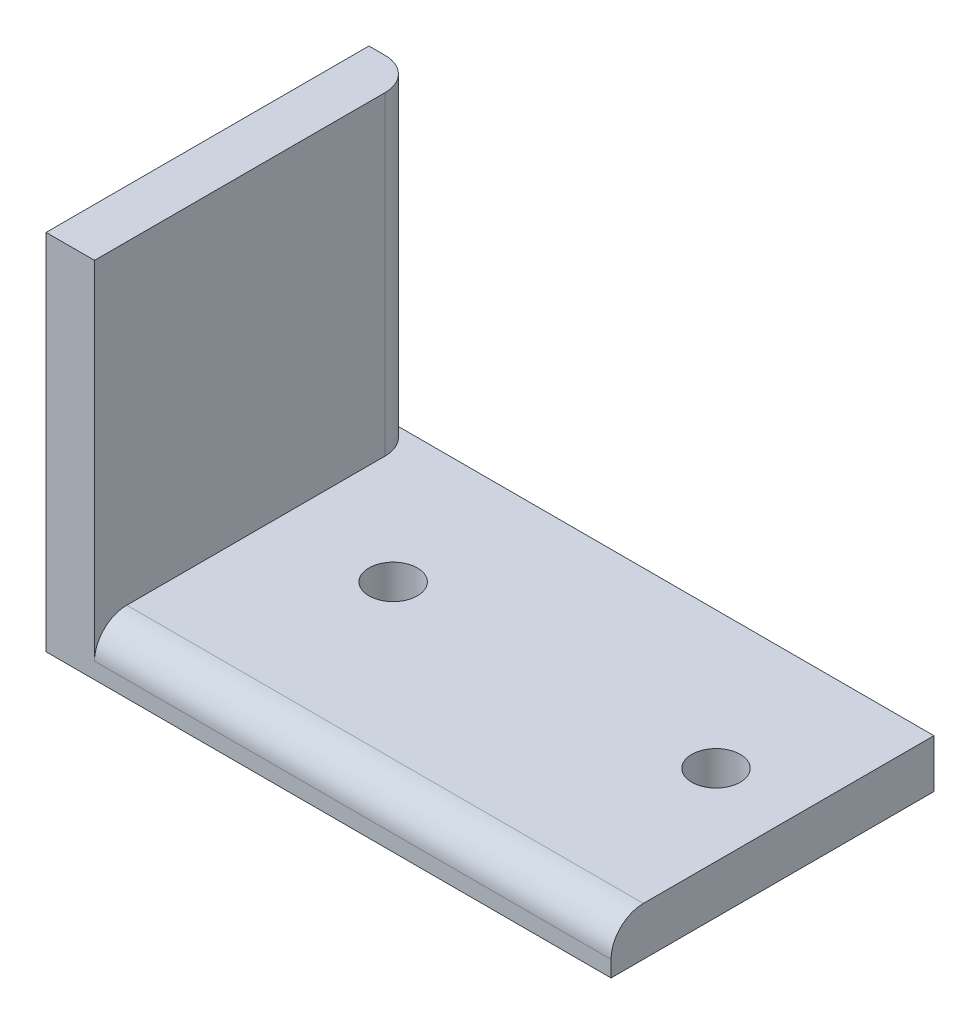
ISO-10303-21;
HEADER;
FILE_DESCRIPTION(('STEP AP214'),'2;1');
FILE_NAME('part.step','',(''),(''),'','','');
FILE_SCHEMA(('AUTOMOTIVE_DESIGN { 1 0 10303 214 1 1 1 1 }'));
ENDSEC;
DATA;
#1=APPLICATION_CONTEXT('core data for automotive mechanical design processes');
#2=APPLICATION_PROTOCOL_DEFINITION('international standard','automotive_design',2000,#1);
#3=PRODUCT_CONTEXT('',#1,'mechanical');
#4=PRODUCT('Part','Part','',(#3));
#5=PRODUCT_RELATED_PRODUCT_CATEGORY('part','',(#4));
#6=PRODUCT_DEFINITION_FORMATION('','',#4);
#7=PRODUCT_DEFINITION_CONTEXT('part definition',#1,'design');
#8=PRODUCT_DEFINITION('design','',#6,#7);
#9=PRODUCT_DEFINITION_SHAPE('','',#8);
#10=(LENGTH_UNIT() NAMED_UNIT(*) SI_UNIT(.MILLI.,.METRE.));
#11=(NAMED_UNIT(*) PLANE_ANGLE_UNIT() SI_UNIT($,.RADIAN.));
#12=(NAMED_UNIT(*) SI_UNIT($,.STERADIAN.) SOLID_ANGLE_UNIT());
#13=UNCERTAINTY_MEASURE_WITH_UNIT(LENGTH_MEASURE(1.E-05),#10,'distance_accuracy_value','');
#14=(GEOMETRIC_REPRESENTATION_CONTEXT(3) GLOBAL_UNCERTAINTY_ASSIGNED_CONTEXT((#13)) GLOBAL_UNIT_ASSIGNED_CONTEXT((#10,
#11,#12)) REPRESENTATION_CONTEXT('',''));
#15=CARTESIAN_POINT('',(0.,0.,0.));
#16=DIRECTION('',(0.,0.,1.));
#17=DIRECTION('',(1.,0.,0.));
#18=AXIS2_PLACEMENT_3D('',#15,#16,#17);
#19=CARTESIAN_POINT('',(0.,90.,40.));
#20=DIRECTION('',(1.,0.,0.));
#21=DIRECTION('',(0.,0.,-1.));
#22=AXIS2_PLACEMENT_3D('',#19,#20,#21);
#23=PLANE('',#22);
#24=DIRECTION('',(0.,-1.,0.));
#25=VECTOR('',#24,1.);
#26=CARTESIAN_POINT('',(0.,90.,-40.));
#27=LINE('',#26,#25);
#28=CARTESIAN_POINT('',(0.,90.,-40.));
#29=VERTEX_POINT('',#28);
#30=CARTESIAN_POINT('',(0.,0.,-40.));
#31=VERTEX_POINT('',#30);
#32=EDGE_CURVE('E131',#29,#31,#27,.T.);
#33=ORIENTED_EDGE('',*,*,#32,.T.);
#34=DIRECTION('',(0.,0.,-1.));
#35=VECTOR('',#34,1.);
#36=CARTESIAN_POINT('',(0.,0.,40.));
#37=LINE('',#36,#35);
#38=CARTESIAN_POINT('',(0.,0.,40.));
#39=VERTEX_POINT('',#38);
#40=EDGE_CURVE('E111',#39,#31,#37,.T.);
#41=ORIENTED_EDGE('',*,*,#40,.F.);
#42=DIRECTION('',(0.,-1.,0.));
#43=VECTOR('',#42,1.);
#44=CARTESIAN_POINT('',(0.,90.,40.));
#45=LINE('',#44,#43);
#46=CARTESIAN_POINT('',(0.,90.,40.));
#47=VERTEX_POINT('',#46);
#48=EDGE_CURVE('E119',#47,#39,#45,.T.);
#49=ORIENTED_EDGE('',*,*,#48,.F.);
#50=DIRECTION('',(0.,0.,-1.));
#51=VECTOR('',#50,1.);
#52=CARTESIAN_POINT('',(0.,90.,40.));
#53=LINE('',#52,#51);
#54=EDGE_CURVE('E168',#47,#29,#53,.T.);
#55=ORIENTED_EDGE('',*,*,#54,.T.);
#56=EDGE_LOOP('',(#33,#41,#49,#55));
#57=FACE_BOUND('',#56,.T.);
#58=ADVANCED_FACE('F41',(#57),#23,.F.);
#59=CARTESIAN_POINT('',(0.,0.,40.));
#60=DIRECTION('',(0.,1.,0.));
#61=DIRECTION('',(0.,0.,1.));
#62=AXIS2_PLACEMENT_3D('',#59,#60,#61);
#63=PLANE('',#62);
#64=CARTESIAN_POINT('',(120.,0.,-6.));
#65=DIRECTION('',(0.,1.,0.));
#66=DIRECTION('',(0.,0.,1.));
#67=AXIS2_PLACEMENT_3D('',#64,#65,#66);
#68=CIRCLE('',#67,6.00000000000002);
#69=CARTESIAN_POINT('',(120.,0.,-12.));
#70=VERTEX_POINT('',#69);
#71=EDGE_CURVE('E162',#70,#70,#68,.T.);
#72=ORIENTED_EDGE('',*,*,#71,.T.);
#73=EDGE_LOOP('',(#72));
#74=FACE_BOUND('',#73,.T.);
#75=CARTESIAN_POINT('',(40.,0.,-6.));
#76=DIRECTION('',(0.,1.,0.));
#77=DIRECTION('',(0.,0.,1.));
#78=AXIS2_PLACEMENT_3D('',#75,#76,#77);
#79=CIRCLE('',#78,5.99999999999999);
#80=CARTESIAN_POINT('',(40.,0.,-12.));
#81=VERTEX_POINT('',#80);
#82=EDGE_CURVE('E152',#81,#81,#79,.T.);
#83=ORIENTED_EDGE('',*,*,#82,.T.);
#84=EDGE_LOOP('',(#83));
#85=FACE_BOUND('',#84,.T.);
#86=DIRECTION('',(1.,0.,0.));
#87=VECTOR('',#86,1.);
#88=CARTESIAN_POINT('',(0.,0.,-40.));
#89=LINE('',#88,#87);
#90=CARTESIAN_POINT('',(140.,0.,-40.));
#91=VERTEX_POINT('',#90);
#92=EDGE_CURVE('E155',#31,#91,#89,.T.);
#93=ORIENTED_EDGE('',*,*,#92,.T.);
#94=DIRECTION('',(0.,0.,-1.));
#95=VECTOR('',#94,1.);
#96=CARTESIAN_POINT('',(140.,0.,40.));
#97=LINE('',#96,#95);
#98=CARTESIAN_POINT('',(140.,0.,40.));
#99=VERTEX_POINT('',#98);
#100=EDGE_CURVE('E114',#99,#91,#97,.T.);
#101=ORIENTED_EDGE('',*,*,#100,.F.);
#102=DIRECTION('',(1.,0.,0.));
#103=VECTOR('',#102,1.);
#104=CARTESIAN_POINT('',(0.,0.,40.));
#105=LINE('',#104,#103);
#106=EDGE_CURVE('E107',#39,#99,#105,.T.);
#107=ORIENTED_EDGE('',*,*,#106,.F.);
#108=ORIENTED_EDGE('',*,*,#40,.T.);
#109=EDGE_LOOP('',(#93,#101,#107,#108));
#110=FACE_BOUND('',#109,.T.);
#111=ADVANCED_FACE('F109',(#74,#85,#110),#63,.F.);
#112=CARTESIAN_POINT('',(140.,0.,40.));
#113=DIRECTION('',(-1.,0.,0.));
#114=DIRECTION('',(0.,0.,1.));
#115=AXIS2_PLACEMENT_3D('',#112,#113,#114);
#116=PLANE('',#115);
#117=DIRECTION('',(0.,0.,-1.));
#118=VECTOR('',#117,1.);
#119=CARTESIAN_POINT('',(140.,12.,40.));
#120=LINE('',#119,#118);
#121=CARTESIAN_POINT('',(140.,12.,32.));
#122=VERTEX_POINT('',#121);
#123=CARTESIAN_POINT('',(140.,12.,-40.));
#124=VERTEX_POINT('',#123);
#125=EDGE_CURVE('E137',#122,#124,#120,.T.);
#126=ORIENTED_EDGE('',*,*,#125,.F.);
#127=CARTESIAN_POINT('',(140.,4.,32.));
#128=DIRECTION('',(-1.,0.,0.));
#129=DIRECTION('',(0.,0.,1.));
#130=AXIS2_PLACEMENT_3D('',#127,#128,#129);
#131=CIRCLE('',#130,8.);
#132=CARTESIAN_POINT('',(140.,4.,40.));
#133=VERTEX_POINT('',#132);
#134=EDGE_CURVE('E142',#122,#133,#131,.F.);
#135=ORIENTED_EDGE('',*,*,#134,.T.);
#136=DIRECTION('',(0.,1.,0.));
#137=VECTOR('',#136,1.);
#138=CARTESIAN_POINT('',(140.,0.,40.));
#139=LINE('',#138,#137);
#140=EDGE_CURVE('E118',#99,#133,#139,.T.);
#141=ORIENTED_EDGE('',*,*,#140,.F.);
#142=ORIENTED_EDGE('',*,*,#100,.T.);
#143=DIRECTION('',(0.,1.,0.));
#144=VECTOR('',#143,1.);
#145=CARTESIAN_POINT('',(140.,0.,-40.));
#146=LINE('',#145,#144);
#147=EDGE_CURVE('E171',#91,#124,#146,.T.);
#148=ORIENTED_EDGE('',*,*,#147,.T.);
#149=EDGE_LOOP('',(#126,#135,#141,#142,#148));
#150=FACE_BOUND('',#149,.T.);
#151=ADVANCED_FACE('F188',(#150),#116,.F.);
#152=CARTESIAN_POINT('',(140.,12.,40.));
#153=DIRECTION('',(0.,-1.,0.));
#154=DIRECTION('',(0.,0.,-1.));
#155=AXIS2_PLACEMENT_3D('',#152,#153,#154);
#156=PLANE('',#155);
#157=CARTESIAN_POINT('',(120.,12.,-6.));
#158=DIRECTION('',(0.,-1.,0.));
#159=DIRECTION('',(0.,0.,-1.));
#160=AXIS2_PLACEMENT_3D('',#157,#158,#159);
#161=CIRCLE('',#160,6.00000000000002);
#162=CARTESIAN_POINT('',(120.,12.,-12.));
#163=VERTEX_POINT('',#162);
#164=EDGE_CURVE('E45',#163,#163,#161,.F.);
#165=ORIENTED_EDGE('',*,*,#164,.F.);
#166=EDGE_LOOP('',(#165));
#167=FACE_BOUND('',#166,.T.);
#168=CARTESIAN_POINT('',(40.,12.,-6.));
#169=DIRECTION('',(0.,-1.,0.));
#170=DIRECTION('',(0.,0.,-1.));
#171=AXIS2_PLACEMENT_3D('',#168,#169,#170);
#172=CIRCLE('',#171,5.99999999999999);
#173=CARTESIAN_POINT('',(40.,12.,-12.));
#174=VERTEX_POINT('',#173);
#175=EDGE_CURVE('E150',#174,#174,#172,.F.);
#176=ORIENTED_EDGE('',*,*,#175,.F.);
#177=EDGE_LOOP('',(#176));
#178=FACE_BOUND('',#177,.T.);
#179=DIRECTION('',(0.,0.,-1.));
#180=VECTOR('',#179,1.);
#181=CARTESIAN_POINT('',(12.,12.,40.));
#182=LINE('',#181,#180);
#183=CARTESIAN_POINT('',(12.,12.,32.));
#184=VERTEX_POINT('',#183);
#185=CARTESIAN_POINT('',(12.,12.,-32.));
#186=VERTEX_POINT('',#185);
#187=EDGE_CURVE('E179',#184,#186,#182,.T.);
#188=ORIENTED_EDGE('',*,*,#187,.F.);
#189=DIRECTION('',(-1.,0.,0.));
#190=VECTOR('',#189,1.);
#191=CARTESIAN_POINT('',(140.,12.,32.));
#192=LINE('',#191,#190);
#193=EDGE_CURVE('E135',#184,#122,#192,.F.);
#194=ORIENTED_EDGE('',*,*,#193,.T.);
#195=ORIENTED_EDGE('',*,*,#125,.T.);
#196=DIRECTION('',(-1.,0.,0.));
#197=VECTOR('',#196,1.);
#198=CARTESIAN_POINT('',(140.,12.,-40.));
#199=LINE('',#198,#197);
#200=CARTESIAN_POINT('',(4.,12.,-40.));
#201=VERTEX_POINT('',#200);
#202=EDGE_CURVE('E57',#124,#201,#199,.T.);
#203=ORIENTED_EDGE('',*,*,#202,.T.);
#204=CARTESIAN_POINT('',(4.,12.,-32.));
#205=DIRECTION('',(0.,-1.,0.));
#206=DIRECTION('',(0.,0.,-1.));
#207=AXIS2_PLACEMENT_3D('',#204,#205,#206);
#208=CIRCLE('',#207,8.);
#209=EDGE_CURVE('E11',#201,#186,#208,.T.);
#210=ORIENTED_EDGE('',*,*,#209,.T.);
#211=EDGE_LOOP('',(#188,#194,#195,#203,#210));
#212=FACE_BOUND('',#211,.T.);
#213=ADVANCED_FACE('F183',(#167,#178,#212),#156,.F.);
#214=CARTESIAN_POINT('',(12.,12.,40.));
#215=DIRECTION('',(-1.,0.,0.));
#216=DIRECTION('',(0.,0.,1.));
#217=AXIS2_PLACEMENT_3D('',#214,#215,#216);
#218=PLANE('',#217);
#219=ORIENTED_EDGE('',*,*,#187,.T.);
#220=DIRECTION('',(0.,1.,0.));
#221=VECTOR('',#220,1.);
#222=CARTESIAN_POINT('',(12.,12.,-32.));
#223=LINE('',#222,#221);
#224=CARTESIAN_POINT('',(12.,90.,-32.));
#225=VERTEX_POINT('',#224);
#226=EDGE_CURVE('E144',#186,#225,#223,.T.);
#227=ORIENTED_EDGE('',*,*,#226,.T.);
#228=DIRECTION('',(0.,0.,-1.));
#229=VECTOR('',#228,1.);
#230=CARTESIAN_POINT('',(12.,90.,40.));
#231=LINE('',#230,#229);
#232=CARTESIAN_POINT('',(12.,90.,40.));
#233=VERTEX_POINT('',#232);
#234=EDGE_CURVE('E177',#233,#225,#231,.T.);
#235=ORIENTED_EDGE('',*,*,#234,.F.);
#236=DIRECTION('',(0.,1.,0.));
#237=VECTOR('',#236,1.);
#238=CARTESIAN_POINT('',(12.,12.,40.));
#239=LINE('',#238,#237);
#240=CARTESIAN_POINT('',(12.,4.,40.));
#241=VERTEX_POINT('',#240);
#242=EDGE_CURVE('E166',#241,#233,#239,.T.);
#243=ORIENTED_EDGE('',*,*,#242,.F.);
#244=CARTESIAN_POINT('',(12.,4.,32.));
#245=DIRECTION('',(-1.,0.,0.));
#246=DIRECTION('',(0.,0.,1.));
#247=AXIS2_PLACEMENT_3D('',#244,#245,#246);
#248=CIRCLE('',#247,8.);
#249=EDGE_CURVE('E50',#241,#184,#248,.T.);
#250=ORIENTED_EDGE('',*,*,#249,.T.);
#251=EDGE_LOOP('',(#219,#227,#235,#243,#250));
#252=FACE_BOUND('',#251,.T.);
#253=ADVANCED_FACE('F196',(#252),#218,.F.);
#254=CARTESIAN_POINT('',(12.,90.,40.));
#255=DIRECTION('',(0.,-1.,0.));
#256=DIRECTION('',(0.,0.,-1.));
#257=AXIS2_PLACEMENT_3D('',#254,#255,#256);
#258=PLANE('',#257);
#259=ORIENTED_EDGE('',*,*,#234,.T.);
#260=CARTESIAN_POINT('',(4.,90.,-32.));
#261=DIRECTION('',(0.,-1.,0.));
#262=DIRECTION('',(0.,0.,-1.));
#263=AXIS2_PLACEMENT_3D('',#260,#261,#262);
#264=CIRCLE('',#263,8.);
#265=CARTESIAN_POINT('',(4.,90.,-40.));
#266=VERTEX_POINT('',#265);
#267=EDGE_CURVE('E65',#225,#266,#264,.F.);
#268=ORIENTED_EDGE('',*,*,#267,.T.);
#269=DIRECTION('',(-1.,0.,0.));
#270=VECTOR('',#269,1.);
#271=CARTESIAN_POINT('',(12.,90.,-40.));
#272=LINE('',#271,#270);
#273=EDGE_CURVE('E128',#266,#29,#272,.T.);
#274=ORIENTED_EDGE('',*,*,#273,.T.);
#275=ORIENTED_EDGE('',*,*,#54,.F.);
#276=DIRECTION('',(-1.,0.,0.));
#277=VECTOR('',#276,1.);
#278=CARTESIAN_POINT('',(12.,90.,40.));
#279=LINE('',#278,#277);
#280=EDGE_CURVE('E124',#233,#47,#279,.T.);
#281=ORIENTED_EDGE('',*,*,#280,.F.);
#282=EDGE_LOOP('',(#259,#268,#274,#275,#281));
#283=FACE_BOUND('',#282,.T.);
#284=ADVANCED_FACE('F202',(#283),#258,.F.);
#285=CARTESIAN_POINT('',(0.,0.,40.));
#286=DIRECTION('',(0.,0.,1.));
#287=DIRECTION('',(1.,0.,0.));
#288=AXIS2_PLACEMENT_3D('',#285,#286,#287);
#289=PLANE('',#288);
#290=ORIENTED_EDGE('',*,*,#140,.T.);
#291=DIRECTION('',(-1.,0.,0.));
#292=VECTOR('',#291,1.);
#293=CARTESIAN_POINT('',(12.,4.,40.));
#294=LINE('',#293,#292);
#295=EDGE_CURVE('E132',#133,#241,#294,.T.);
#296=ORIENTED_EDGE('',*,*,#295,.T.);
#297=ORIENTED_EDGE('',*,*,#242,.T.);
#298=ORIENTED_EDGE('',*,*,#280,.T.);
#299=ORIENTED_EDGE('',*,*,#48,.T.);
#300=ORIENTED_EDGE('',*,*,#106,.T.);
#301=EDGE_LOOP('',(#290,#296,#297,#298,#299,#300));
#302=FACE_BOUND('',#301,.T.);
#303=ADVANCED_FACE('F122',(#302),#289,.T.);
#304=CARTESIAN_POINT('',(0.,0.,-40.));
#305=DIRECTION('',(0.,0.,1.));
#306=DIRECTION('',(1.,0.,0.));
#307=AXIS2_PLACEMENT_3D('',#304,#305,#306);
#308=PLANE('',#307);
#309=ORIENTED_EDGE('',*,*,#273,.F.);
#310=DIRECTION('',(0.,1.,0.));
#311=VECTOR('',#310,1.);
#312=CARTESIAN_POINT('',(4.,0.,-40.));
#313=LINE('',#312,#311);
#314=EDGE_CURVE('E148',#266,#201,#313,.F.);
#315=ORIENTED_EDGE('',*,*,#314,.T.);
#316=ORIENTED_EDGE('',*,*,#202,.F.);
#317=ORIENTED_EDGE('',*,*,#147,.F.);
#318=ORIENTED_EDGE('',*,*,#92,.F.);
#319=ORIENTED_EDGE('',*,*,#32,.F.);
#320=EDGE_LOOP('',(#309,#315,#316,#317,#318,#319));
#321=FACE_BOUND('',#320,.T.);
#322=ADVANCED_FACE('F190',(#321),#308,.F.);
#323=CARTESIAN_POINT('',(0.,4.,32.));
#324=DIRECTION('',(1.,0.,0.));
#325=DIRECTION('',(0.,0.,-1.));
#326=AXIS2_PLACEMENT_3D('',#323,#324,#325);
#327=CYLINDRICAL_SURFACE('',#326,8.);
#328=ORIENTED_EDGE('',*,*,#134,.F.);
#329=ORIENTED_EDGE('',*,*,#193,.F.);
#330=ORIENTED_EDGE('',*,*,#249,.F.);
#331=ORIENTED_EDGE('',*,*,#295,.F.);
#332=EDGE_LOOP('',(#328,#329,#330,#331));
#333=FACE_BOUND('',#332,.T.);
#334=ADVANCED_FACE('F201',(#333),#327,.T.);
#335=CARTESIAN_POINT('',(4.,12.,-32.));
#336=DIRECTION('',(0.,1.,0.));
#337=DIRECTION('',(0.,0.,1.));
#338=AXIS2_PLACEMENT_3D('',#335,#336,#337);
#339=CYLINDRICAL_SURFACE('',#338,8.);
#340=ORIENTED_EDGE('',*,*,#209,.F.);
#341=ORIENTED_EDGE('',*,*,#314,.F.);
#342=ORIENTED_EDGE('',*,*,#267,.F.);
#343=ORIENTED_EDGE('',*,*,#226,.F.);
#344=EDGE_LOOP('',(#340,#341,#342,#343));
#345=FACE_BOUND('',#344,.T.);
#346=ADVANCED_FACE('F43',(#345),#339,.T.);
#347=CARTESIAN_POINT('',(40.,90.,-6.));
#348=DIRECTION('',(0.,-1.,0.));
#349=DIRECTION('',(0.,0.,-1.));
#350=AXIS2_PLACEMENT_3D('',#347,#348,#349);
#351=CYLINDRICAL_SURFACE('',#350,5.99999999999999);
#352=CARTESIAN_POINT('',(40.,0.,-12.));
#353=CARTESIAN_POINT('',(40.,0.124999999999986,-12.));
#354=CARTESIAN_POINT('',(40.,0.249999999999986,-12.));
#355=CARTESIAN_POINT('',(40.,0.499999999999987,-12.));
#356=CARTESIAN_POINT('',(40.,0.624999999999987,-12.));
#357=CARTESIAN_POINT('',(40.,0.874999999999987,-12.));
#358=CARTESIAN_POINT('',(40.,0.999999999999987,-12.));
#359=CARTESIAN_POINT('',(40.,1.24999999999999,-12.));
#360=CARTESIAN_POINT('',(40.,1.37499999999999,-12.));
#361=CARTESIAN_POINT('',(40.,1.62499999999999,-12.));
#362=CARTESIAN_POINT('',(40.,1.74999999999999,-12.));
#363=CARTESIAN_POINT('',(40.,1.99999999999999,-12.));
#364=CARTESIAN_POINT('',(40.,2.12499999999999,-12.));
#365=CARTESIAN_POINT('',(40.,2.37499999999999,-12.));
#366=CARTESIAN_POINT('',(40.,2.49999999999999,-12.));
#367=CARTESIAN_POINT('',(40.,2.74999999999999,-12.));
#368=CARTESIAN_POINT('',(40.,2.87499999999999,-12.));
#369=CARTESIAN_POINT('',(40.,3.12499999999999,-12.));
#370=CARTESIAN_POINT('',(40.,3.24999999999999,-12.));
#371=CARTESIAN_POINT('',(40.,3.49999999999999,-12.));
#372=CARTESIAN_POINT('',(40.,3.62499999999999,-12.));
#373=CARTESIAN_POINT('',(40.,3.87499999999999,-12.));
#374=CARTESIAN_POINT('',(40.,3.99999999999999,-12.));
#375=CARTESIAN_POINT('',(40.,4.24999999999999,-12.));
#376=CARTESIAN_POINT('',(40.,4.37499999999999,-12.));
#377=CARTESIAN_POINT('',(40.,4.62499999999999,-12.));
#378=CARTESIAN_POINT('',(40.,4.74999999999999,-12.));
#379=CARTESIAN_POINT('',(40.,4.99999999999999,-12.));
#380=CARTESIAN_POINT('',(40.,5.12499999999999,-12.));
#381=CARTESIAN_POINT('',(40.,5.37499999999999,-12.));
#382=CARTESIAN_POINT('',(40.,5.49999999999999,-12.));
#383=CARTESIAN_POINT('',(40.,5.74999999999999,-12.));
#384=CARTESIAN_POINT('',(40.,5.87499999999999,-12.));
#385=CARTESIAN_POINT('',(40.,6.12499999999999,-12.));
#386=CARTESIAN_POINT('',(40.,6.24999999999999,-12.));
#387=CARTESIAN_POINT('',(40.,6.49999999999999,-12.));
#388=CARTESIAN_POINT('',(40.,6.62499999999999,-12.));
#389=CARTESIAN_POINT('',(40.,6.87499999999999,-12.));
#390=CARTESIAN_POINT('',(40.,6.99999999999999,-12.));
#391=CARTESIAN_POINT('',(40.,7.24999999999999,-12.));
#392=CARTESIAN_POINT('',(40.,7.37499999999999,-12.));
#393=CARTESIAN_POINT('',(40.,7.62499999999999,-12.));
#394=CARTESIAN_POINT('',(40.,7.74999999999999,-12.));
#395=CARTESIAN_POINT('',(40.,7.99999999999999,-12.));
#396=CARTESIAN_POINT('',(40.,8.12499999999999,-12.));
#397=CARTESIAN_POINT('',(40.,8.37499999999999,-12.));
#398=CARTESIAN_POINT('',(40.,8.49999999999999,-12.));
#399=CARTESIAN_POINT('',(40.,8.74999999999999,-12.));
#400=CARTESIAN_POINT('',(40.,8.87499999999999,-12.));
#401=CARTESIAN_POINT('',(40.,9.12499999999999,-12.));
#402=CARTESIAN_POINT('',(40.,9.24999999999999,-12.));
#403=CARTESIAN_POINT('',(40.,9.49999999999999,-12.));
#404=CARTESIAN_POINT('',(40.,9.62499999999999,-12.));
#405=CARTESIAN_POINT('',(40.,9.87499999999999,-12.));
#406=CARTESIAN_POINT('',(40.,9.99999999999999,-12.));
#407=CARTESIAN_POINT('',(40.,10.25,-12.));
#408=CARTESIAN_POINT('',(40.,10.375,-12.));
#409=CARTESIAN_POINT('',(40.,10.625,-12.));
#410=CARTESIAN_POINT('',(40.,10.75,-12.));
#411=CARTESIAN_POINT('',(40.,11.,-12.));
#412=CARTESIAN_POINT('',(40.,11.125,-12.));
#413=CARTESIAN_POINT('',(40.,11.375,-12.));
#414=CARTESIAN_POINT('',(40.,11.5,-12.));
#415=CARTESIAN_POINT('',(40.,11.75,-12.));
#416=CARTESIAN_POINT('',(40.,11.875,-12.));
#417=CARTESIAN_POINT('',(40.,12.,-12.));
#418=B_SPLINE_CURVE_WITH_KNOTS('',3,(#352,#353,#354,#355,#356,#357,#358,#359,#360,#361,#362,
#363,#364,#365,#366,#367,#368,#369,#370,#371,#372,#373,#374,#375,#376,#377,#378,#379,#380,#381,
#382,#383,#384,#385,#386,#387,#388,#389,#390,#391,#392,#393,#394,#395,#396,#397,#398,#399,#400,
#401,#402,#403,#404,#405,#406,#407,#408,#409,#410,#411,#412,#413,#414,#415,#416,#417),
.UNSPECIFIED.,.F.,.F.,(4,2,2,2,2,2,2,2,2,2,2,2,2,2,2,2,2,2,2,2,2,2,2,2,2,2,2,2,2,2,2,2,4),(0.,
0.375,0.750000000000001,1.125,1.5,1.875,2.25,2.625,3.,3.375,3.75,4.125,4.5,4.875,5.25,
5.62500000000001,6.00000000000001,6.37500000000001,6.75000000000001,7.12500000000001,
7.50000000000001,7.87500000000001,8.25000000000001,8.62500000000001,9.00000000000001,
9.37500000000001,9.75000000000001,10.125,10.5,10.875,11.25,11.625,12.),.UNSPECIFIED.);
#419=EDGE_CURVE('BSEAM226',#81,#174,#418,.T.);
#420=ORIENTED_EDGE('',*,*,#82,.F.);
#421=ORIENTED_EDGE('',*,*,#175,.T.);
#422=ORIENTED_EDGE('',*,*,#419,.T.);
#423=ORIENTED_EDGE('',*,*,#419,.F.);
#424=EDGE_LOOP('',(#420,#422,#421,#423));
#425=FACE_BOUND('',#424,.T.);
#426=ADVANCED_FACE('F226',(#425),#351,.F.);
#427=CARTESIAN_POINT('',(120.,90.,-6.));
#428=DIRECTION('',(0.,-1.,0.));
#429=DIRECTION('',(0.,0.,-1.));
#430=AXIS2_PLACEMENT_3D('',#427,#428,#429);
#431=CYLINDRICAL_SURFACE('',#430,6.00000000000002);
#432=CARTESIAN_POINT('',(120.,0.,-12.));
#433=CARTESIAN_POINT('',(120.,0.124999999999986,-12.));
#434=CARTESIAN_POINT('',(120.,0.249999999999986,-12.));
#435=CARTESIAN_POINT('',(120.,0.499999999999987,-12.));
#436=CARTESIAN_POINT('',(120.,0.624999999999987,-12.));
#437=CARTESIAN_POINT('',(120.,0.874999999999987,-12.));
#438=CARTESIAN_POINT('',(120.,0.999999999999987,-12.));
#439=CARTESIAN_POINT('',(120.,1.24999999999999,-12.));
#440=CARTESIAN_POINT('',(120.,1.37499999999999,-12.));
#441=CARTESIAN_POINT('',(120.,1.62499999999999,-12.));
#442=CARTESIAN_POINT('',(120.,1.74999999999999,-12.));
#443=CARTESIAN_POINT('',(120.,1.99999999999999,-12.));
#444=CARTESIAN_POINT('',(120.,2.12499999999999,-12.));
#445=CARTESIAN_POINT('',(120.,2.37499999999999,-12.));
#446=CARTESIAN_POINT('',(120.,2.49999999999999,-12.));
#447=CARTESIAN_POINT('',(120.,2.74999999999999,-12.));
#448=CARTESIAN_POINT('',(120.,2.87499999999999,-12.));
#449=CARTESIAN_POINT('',(120.,3.12499999999999,-12.));
#450=CARTESIAN_POINT('',(120.,3.24999999999999,-12.));
#451=CARTESIAN_POINT('',(120.,3.49999999999999,-12.));
#452=CARTESIAN_POINT('',(120.,3.62499999999999,-12.));
#453=CARTESIAN_POINT('',(120.,3.87499999999999,-12.));
#454=CARTESIAN_POINT('',(120.,3.99999999999999,-12.));
#455=CARTESIAN_POINT('',(120.,4.24999999999999,-12.));
#456=CARTESIAN_POINT('',(120.,4.37499999999999,-12.));
#457=CARTESIAN_POINT('',(120.,4.62499999999999,-12.));
#458=CARTESIAN_POINT('',(120.,4.74999999999999,-12.));
#459=CARTESIAN_POINT('',(120.,4.99999999999999,-12.));
#460=CARTESIAN_POINT('',(120.,5.12499999999999,-12.));
#461=CARTESIAN_POINT('',(120.,5.37499999999999,-12.));
#462=CARTESIAN_POINT('',(120.,5.49999999999999,-12.));
#463=CARTESIAN_POINT('',(120.,5.74999999999999,-12.));
#464=CARTESIAN_POINT('',(120.,5.87499999999999,-12.));
#465=CARTESIAN_POINT('',(120.,6.12499999999999,-12.));
#466=CARTESIAN_POINT('',(120.,6.24999999999999,-12.));
#467=CARTESIAN_POINT('',(120.,6.49999999999999,-12.));
#468=CARTESIAN_POINT('',(120.,6.62499999999999,-12.));
#469=CARTESIAN_POINT('',(120.,6.87499999999999,-12.));
#470=CARTESIAN_POINT('',(120.,6.99999999999999,-12.));
#471=CARTESIAN_POINT('',(120.,7.24999999999999,-12.));
#472=CARTESIAN_POINT('',(120.,7.37499999999999,-12.));
#473=CARTESIAN_POINT('',(120.,7.62499999999999,-12.));
#474=CARTESIAN_POINT('',(120.,7.74999999999999,-12.));
#475=CARTESIAN_POINT('',(120.,7.99999999999999,-12.));
#476=CARTESIAN_POINT('',(120.,8.12499999999999,-12.));
#477=CARTESIAN_POINT('',(120.,8.37499999999999,-12.));
#478=CARTESIAN_POINT('',(120.,8.49999999999999,-12.));
#479=CARTESIAN_POINT('',(120.,8.74999999999999,-12.));
#480=CARTESIAN_POINT('',(120.,8.87499999999999,-12.));
#481=CARTESIAN_POINT('',(120.,9.12499999999999,-12.));
#482=CARTESIAN_POINT('',(120.,9.24999999999999,-12.));
#483=CARTESIAN_POINT('',(120.,9.49999999999999,-12.));
#484=CARTESIAN_POINT('',(120.,9.62499999999999,-12.));
#485=CARTESIAN_POINT('',(120.,9.87499999999999,-12.));
#486=CARTESIAN_POINT('',(120.,9.99999999999999,-12.));
#487=CARTESIAN_POINT('',(120.,10.25,-12.));
#488=CARTESIAN_POINT('',(120.,10.375,-12.));
#489=CARTESIAN_POINT('',(120.,10.625,-12.));
#490=CARTESIAN_POINT('',(120.,10.75,-12.));
#491=CARTESIAN_POINT('',(120.,11.,-12.));
#492=CARTESIAN_POINT('',(120.,11.125,-12.));
#493=CARTESIAN_POINT('',(120.,11.375,-12.));
#494=CARTESIAN_POINT('',(120.,11.5,-12.));
#495=CARTESIAN_POINT('',(120.,11.75,-12.));
#496=CARTESIAN_POINT('',(120.,11.875,-12.));
#497=CARTESIAN_POINT('',(120.,12.,-12.));
#498=B_SPLINE_CURVE_WITH_KNOTS('',3,(#432,#433,#434,#435,#436,#437,#438,#439,#440,#441,#442,
#443,#444,#445,#446,#447,#448,#449,#450,#451,#452,#453,#454,#455,#456,#457,#458,#459,#460,#461,
#462,#463,#464,#465,#466,#467,#468,#469,#470,#471,#472,#473,#474,#475,#476,#477,#478,#479,#480,
#481,#482,#483,#484,#485,#486,#487,#488,#489,#490,#491,#492,#493,#494,#495,#496,#497),
.UNSPECIFIED.,.F.,.F.,(4,2,2,2,2,2,2,2,2,2,2,2,2,2,2,2,2,2,2,2,2,2,2,2,2,2,2,2,2,2,2,2,4),(0.,
0.375,0.750000000000001,1.125,1.5,1.875,2.25,2.625,3.,3.375,3.75,4.125,4.5,4.875,5.25,
5.62500000000001,6.00000000000001,6.37500000000001,6.75000000000001,7.12500000000001,
7.50000000000001,7.87500000000001,8.25000000000001,8.62500000000001,9.00000000000001,
9.37500000000001,9.75000000000001,10.125,10.5,10.875,11.25,11.625,12.),.UNSPECIFIED.);
#499=EDGE_CURVE('BSEAM232',#70,#163,#498,.T.);
#500=ORIENTED_EDGE('',*,*,#71,.F.);
#501=ORIENTED_EDGE('',*,*,#164,.T.);
#502=ORIENTED_EDGE('',*,*,#499,.T.);
#503=ORIENTED_EDGE('',*,*,#499,.F.);
#504=EDGE_LOOP('',(#500,#502,#501,#503));
#505=FACE_BOUND('',#504,.T.);
#506=ADVANCED_FACE('F232',(#505),#431,.F.);
#507=CLOSED_SHELL('',(#58,#111,#151,#213,#253,#284,#303,#322,#334,#346,#426,#506));
#508=MANIFOLD_SOLID_BREP('B2',#507);
#509=ADVANCED_BREP_SHAPE_REPRESENTATION('',(#18,#508),#14);
#510=SHAPE_DEFINITION_REPRESENTATION(#9,#509);
ENDSEC;
END-ISO-10303-21;
